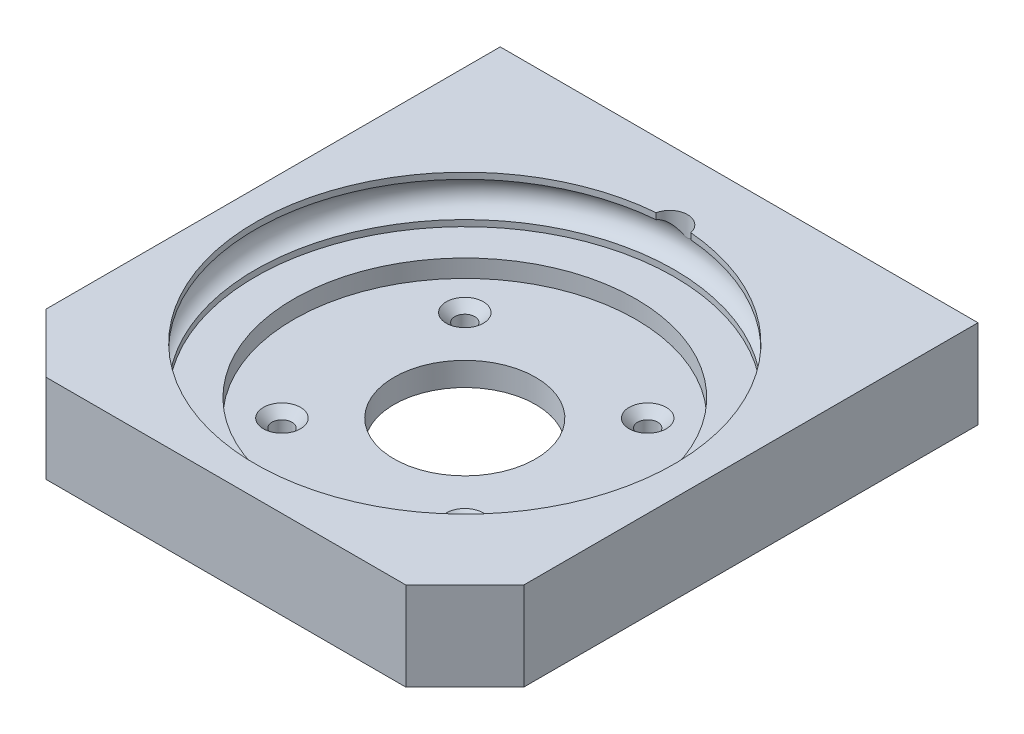
ISO-10303-21;
HEADER;
FILE_DESCRIPTION(('STEP AP214'),'2;1');
FILE_NAME('part.step','',(''),(''),'','','');
FILE_SCHEMA(('AUTOMOTIVE_DESIGN { 1 0 10303 214 1 1 1 1 }'));
ENDSEC;
DATA;
#1=APPLICATION_CONTEXT('core data for automotive mechanical design processes');
#2=APPLICATION_PROTOCOL_DEFINITION('international standard','automotive_design',2000,#1);
#3=PRODUCT_CONTEXT('',#1,'mechanical');
#4=PRODUCT('Part','Part','',(#3));
#5=PRODUCT_RELATED_PRODUCT_CATEGORY('part','',(#4));
#6=PRODUCT_DEFINITION_FORMATION('','',#4);
#7=PRODUCT_DEFINITION_CONTEXT('part definition',#1,'design');
#8=PRODUCT_DEFINITION('design','',#6,#7);
#9=PRODUCT_DEFINITION_SHAPE('','',#8);
#10=(LENGTH_UNIT() NAMED_UNIT(*) SI_UNIT(.MILLI.,.METRE.));
#11=(NAMED_UNIT(*) PLANE_ANGLE_UNIT() SI_UNIT($,.RADIAN.));
#12=(NAMED_UNIT(*) SI_UNIT($,.STERADIAN.) SOLID_ANGLE_UNIT());
#13=UNCERTAINTY_MEASURE_WITH_UNIT(LENGTH_MEASURE(1.E-05),#10,'distance_accuracy_value','');
#14=(GEOMETRIC_REPRESENTATION_CONTEXT(3) GLOBAL_UNCERTAINTY_ASSIGNED_CONTEXT((#13)) GLOBAL_UNIT_ASSIGNED_CONTEXT((#10,
#11,#12)) REPRESENTATION_CONTEXT('',''));
#15=CARTESIAN_POINT('',(0.,0.,0.));
#16=DIRECTION('',(0.,0.,1.));
#17=DIRECTION('',(1.,0.,0.));
#18=AXIS2_PLACEMENT_3D('',#15,#16,#17);
#19=CARTESIAN_POINT('',(0.,0.,0.));
#20=DIRECTION('',(0.,-1.,0.));
#21=DIRECTION('',(0.,0.,-1.));
#22=AXIS2_PLACEMENT_3D('',#19,#20,#21);
#23=CYLINDRICAL_SURFACE('',#22,35.5);
#24=DIRECTION('',(0.,-1.,0.));
#25=VECTOR('',#24,1.);
#26=CARTESIAN_POINT('',(2.93340513019144,12.,-35.3785971223021));
#27=LINE('',#26,#25);
#28=CARTESIAN_POINT('',(2.93340513019144,9.95634909981889,-35.3785971223022));
#29=VERTEX_POINT('',#28);
#30=CARTESIAN_POINT('',(2.93340513019144,11.,-35.3785971223022));
#31=VERTEX_POINT('',#30);
#32=EDGE_CURVE('E241',#29,#31,#27,.F.);
#33=ORIENTED_EDGE('',*,*,#32,.F.);
#34=CARTESIAN_POINT('',(0.,9.95634909981889,0.));
#35=DIRECTION('',(0.,-1.,0.));
#36=DIRECTION('',(0.,0.,-1.));
#37=AXIS2_PLACEMENT_3D('',#34,#35,#36);
#38=CIRCLE('',#37,35.5);
#39=CARTESIAN_POINT('',(-2.93340513019144,9.95634909981889,-35.3785971223022));
#40=VERTEX_POINT('',#39);
#41=EDGE_CURVE('E250',#40,#29,#38,.F.);
#42=ORIENTED_EDGE('',*,*,#41,.F.);
#43=DIRECTION('',(0.,-1.,0.));
#44=VECTOR('',#43,1.);
#45=CARTESIAN_POINT('',(-2.93340513019144,12.,-35.3785971223021));
#46=LINE('',#45,#44);
#47=CARTESIAN_POINT('',(-2.93340513019145,11.,-35.3785971223022));
#48=VERTEX_POINT('',#47);
#49=EDGE_CURVE('E233',#48,#40,#46,.T.);
#50=ORIENTED_EDGE('',*,*,#49,.F.);
#51=CARTESIAN_POINT('',(0.,11.,0.));
#52=DIRECTION('',(0.,-1.,0.));
#53=DIRECTION('',(0.,0.,-1.));
#54=AXIS2_PLACEMENT_3D('',#51,#52,#53);
#55=CIRCLE('',#54,35.5);
#56=EDGE_CURVE('E249',#31,#48,#55,.T.);
#57=ORIENTED_EDGE('',*,*,#56,.F.);
#58=EDGE_LOOP('',(#33,#42,#50,#57));
#59=FACE_BOUND('',#58,.T.);
#60=ADVANCED_FACE('F73',(#59),#23,.F.);
#61=CARTESIAN_POINT('',(0.,7.,0.));
#62=DIRECTION('',(0.,1.,0.));
#63=DIRECTION('',(0.,0.,1.));
#64=AXIS2_PLACEMENT_3D('',#61,#62,#63);
#65=TOROIDAL_SURFACE('',#64,34.75,3.05);
#66=CARTESIAN_POINT('',(0.,4.04365090018111,0.));
#67=DIRECTION('',(0.,1.,0.));
#68=DIRECTION('',(0.,0.,1.));
#69=AXIS2_PLACEMENT_3D('',#66,#67,#68);
#70=CIRCLE('',#69,35.5);
#71=CARTESIAN_POINT('',(0.,4.04365090018111,35.5));
#72=VERTEX_POINT('',#71);
#73=EDGE_CURVE('E245',#72,#72,#70,.F.);
#74=ORIENTED_EDGE('',*,*,#73,.T.);
#75=EDGE_LOOP('',(#74));
#76=FACE_BOUND('',#75,.T.);
#77=ORIENTED_EDGE('',*,*,#41,.T.);
#78=CARTESIAN_POINT('',(2.93357769228857,9.9565490998189,-35.3777913055362));
#79=CARTESIAN_POINT('',(2.91681852167683,9.93712004652138,-35.4561381258334));
#80=CARTESIAN_POINT('',(2.89706638531666,9.91491923800307,-35.5330652934432));
#81=CARTESIAN_POINT('',(2.85213354783402,9.86558276313324,-35.68353022709));
#82=CARTESIAN_POINT('',(2.82696252281035,9.83845590619164,-35.7570737545699));
#83=CARTESIAN_POINT('',(2.74467711357435,9.75114422744604,-35.970583603288));
#84=CARTESIAN_POINT('',(2.68038469278166,9.6845599494195,-36.1052269553901));
#85=CARTESIAN_POINT('',(2.52101398844778,9.52263714679613,-36.385840933118));
#86=CARTESIAN_POINT('',(2.4222794843095,9.42419458244767,-36.527876323929));
#87=CARTESIAN_POINT('',(2.20774315577035,9.21380910726637,-36.7882593406908));
#88=CARTESIAN_POINT('',(2.0918499714312,9.10179455227378,-36.9064716344005));
#89=CARTESIAN_POINT('',(1.88927351465423,8.9090304508235,-37.082815781667));
#90=CARTESIAN_POINT('',(1.80608443682101,8.83062532013071,-37.1476980302981));
#91=CARTESIAN_POINT('',(1.63499972765948,8.67123766592784,-37.2674764107356));
#92=CARTESIAN_POINT('',(1.54710173533544,8.59025385791051,-37.3223674712605));
#93=CARTESIAN_POINT('',(1.36731581757132,8.42716897831543,-37.4222650587613));
#94=CARTESIAN_POINT('',(1.27543766385374,8.34507094893154,-37.4672943143007));
#95=CARTESIAN_POINT('',(1.08748304388202,8.181115849756,-37.5478308600264));
#96=CARTESIAN_POINT('',(0.991409716626375,8.09925864711047,-37.5833451323951));
#97=CARTESIAN_POINT('',(0.830540031272119,7.96867350822542,-37.6334722120682));
#98=CARTESIAN_POINT('',(0.767419882316833,7.91896042695869,-37.6509435246551));
#99=CARTESIAN_POINT('',(0.638023053927769,7.82235093915175,-37.6821285792818));
#100=CARTESIAN_POINT('',(0.571745155656029,7.77545563627917,-37.6958408563773));
#101=CARTESIAN_POINT('',(0.456863092403969,7.70264186637944,-37.7153769925678));
#102=CARTESIAN_POINT('',(0.409621859505793,7.67489938826571,-37.7223117527688));
#103=CARTESIAN_POINT('',(0.311998249444104,7.62495381344345,-37.7341355484197));
#104=CARTESIAN_POINT('',(0.261624115589112,7.60273688953676,-37.7390297114924));
#105=CARTESIAN_POINT('',(0.175287569663979,7.57432709430206,-37.7450693295637));
#106=CARTESIAN_POINT('',(0.140364204275247,7.56524978523006,-37.746925837516));
#107=CARTESIAN_POINT('',(0.0695067562920698,7.5530289429442,-37.7494025584906));
#108=CARTESIAN_POINT('',(0.0335765551946004,7.54986514551429,-37.7500269939468));
#109=CARTESIAN_POINT('',(-0.0383704766689572,7.55014446114433,-37.7499710923409));
#110=CARTESIAN_POINT('',(-0.0743872166960304,7.55360875004191,-37.7492865733504));
#111=CARTESIAN_POINT('',(-0.145357912222274,7.56641478230117,-37.7466880857307));
#112=CARTESIAN_POINT('',(-0.180308283556722,7.57577445449057,-37.7447703663631));
#113=CARTESIAN_POINT('',(-0.287725949142726,7.61182500636119,-37.7370778836044));
#114=CARTESIAN_POINT('',(-0.357374622448034,7.64609371954267,-37.7294004148712));
#115=CARTESIAN_POINT('',(-0.491598193215968,7.72284253640532,-37.7102330528399));
#116=CARTESIAN_POINT('',(-0.556121745535096,7.76539381438275,-37.6987094465921));
#117=CARTESIAN_POINT('',(-0.669397199331338,7.84540894656481,-37.6748139910309));
#118=CARTESIAN_POINT('',(-0.718743493297258,7.88221335856247,-37.6630612081378));
#119=CARTESIAN_POINT('',(-0.815833685027164,7.95716155305739,-37.6373760943515));
#120=CARTESIAN_POINT('',(-0.863576879154051,7.99530590903692,-37.6234428211953));
#121=CARTESIAN_POINT('',(-1.00506389342119,8.11085973863013,-37.5783686844568));
#122=CARTESIAN_POINT('',(-1.09694859009175,8.18930275768496,-37.5439786291303));
#123=CARTESIAN_POINT('',(-1.27662460550438,8.34617752836101,-37.4665703836723));
#124=CARTESIAN_POINT('',(-1.36442374417502,8.42460898868724,-37.4235695890444));
#125=CARTESIAN_POINT('',(-1.53613708079947,8.58024908926615,-37.3287391324199));
#126=CARTESIAN_POINT('',(-1.62005428446559,8.65745864407599,-37.2769164516535));
#127=CARTESIAN_POINT('',(-1.77241118462468,8.79915829898961,-37.1719590600469));
#128=CARTESIAN_POINT('',(-1.84138845949647,8.86393308329642,-37.1199927235774));
#129=CARTESIAN_POINT('',(-1.97580372560904,8.99119312336032,-37.0091588000968));
#130=CARTESIAN_POINT('',(-2.04124101180683,9.05367792223828,-36.9502898456647));
#131=CARTESIAN_POINT('',(-2.23132584810941,9.23659847801168,-36.7631423510781));
#132=CARTESIAN_POINT('',(-2.3500264139525,9.35276225866135,-36.6241345568339));
#133=CARTESIAN_POINT('',(-2.53618892329528,9.53807892434234,-36.3583021156226));
#134=CARTESIAN_POINT('',(-2.6088787357026,9.61151391423537,-36.2380870239174));
#135=CARTESIAN_POINT('',(-2.7386686830064,9.74490856749262,-35.9828939471452));
#136=CARTESIAN_POINT('',(-2.79582066357193,9.80491292389318,-35.8479672165023));
#137=CARTESIAN_POINT('',(-2.86122008050853,9.87553189675219,-35.653648126164));
#138=CARTESIAN_POINT('',(-2.87774148933525,9.89361413084943,-35.5996133628247));
#139=CARTESIAN_POINT('',(-2.90788471084407,9.92712634236118,-35.4898926827029));
#140=CARTESIAN_POINT('',(-2.92150439462234,9.94255437088241,-35.4342055875481));
#141=CARTESIAN_POINT('',(-2.93357769228857,9.95654909981889,-35.3777913055362));
#142=B_SPLINE_CURVE_WITH_KNOTS('',3,(#78,#79,#80,#81,#82,#83,#84,#85,#86,#87,#88,#89,#90,#91,
#92,#93,#94,#95,#96,#97,#98,#99,#100,#101,#102,#103,#104,#105,#106,#107,#108,#109,#110,#111,
#112,#113,#114,#115,#116,#117,#118,#119,#120,#121,#122,#123,#124,#125,#126,#127,#128,#129,#130,
#131,#132,#133,#134,#135,#136,#137,#138,#139,#140,#141),.UNSPECIFIED.,.F.,.F.,(4,2,2,2,2,2,2,2,
2,2,2,2,2,2,2,2,2,2,2,2,2,2,2,2,2,2,2,2,2,2,2,4),(0.,0.247068873927623,0.493700181725903,
0.981349651084765,1.57536627773394,2.17266770653428,2.56654613560895,2.96062393355249,
3.35378371036501,3.74665418777205,3.99321838902479,4.23987854334683,4.40535324197185,
4.57040959180619,4.67839753688297,4.7860147493383,4.89397635841886,5.00226789228376,
5.23443772502072,5.46869853984813,5.65660416856953,5.84459122298041,6.22100710195904,
6.59667007729738,6.97203714076914,7.29559386058487,7.61921478620871,8.26518750001138,
8.73917848205436,9.21156790837591,9.38942147520736,9.56740508162527),.UNSPECIFIED.);
#143=EDGE_CURVE('E265',#29,#40,#142,.T.);
#144=ORIENTED_EDGE('',*,*,#143,.T.);
#145=EDGE_LOOP('',(#77,#144));
#146=FACE_BOUND('',#145,.T.);
#147=ADVANCED_FACE('F280',(#76,#146),#65,.F.);
#148=CARTESIAN_POINT('',(0.,3.,0.));
#149=DIRECTION('',(0.,-1.,0.));
#150=DIRECTION('',(0.,0.,-1.));
#151=AXIS2_PLACEMENT_3D('',#148,#149,#150);
#152=CIRCLE('',#151,35.5);
#153=CARTESIAN_POINT('',(0.,3.,-35.5));
#154=VERTEX_POINT('',#153);
#155=EDGE_CURVE('E246',#154,#154,#152,.T.);
#156=ORIENTED_EDGE('',*,*,#155,.T.);
#157=EDGE_LOOP('',(#156));
#158=FACE_BOUND('',#157,.T.);
#159=ORIENTED_EDGE('',*,*,#73,.F.);
#160=EDGE_LOOP('',(#159));
#161=FACE_BOUND('',#160,.T.);
#162=ADVANCED_FACE('F366',(#158,#161),#23,.F.);
#163=CARTESIAN_POINT('',(-29.,3.,0.));
#164=DIRECTION('',(0.,-1.,0.));
#165=DIRECTION('',(0.,0.,-1.));
#166=AXIS2_PLACEMENT_3D('',#163,#164,#165);
#167=PLANE('',#166);
#168=ORIENTED_EDGE('',*,*,#155,.F.);
#169=EDGE_LOOP('',(#168));
#170=FACE_BOUND('',#169,.T.);
#171=CARTESIAN_POINT('',(0.,3.,0.));
#172=DIRECTION('',(0.,-1.,0.));
#173=DIRECTION('',(0.,0.,-1.));
#174=AXIS2_PLACEMENT_3D('',#171,#172,#173);
#175=CIRCLE('',#174,29.);
#176=CARTESIAN_POINT('',(0.,3.,-29.));
#177=VERTEX_POINT('',#176);
#178=EDGE_CURVE('E262',#177,#177,#175,.T.);
#179=ORIENTED_EDGE('',*,*,#178,.T.);
#180=EDGE_LOOP('',(#179));
#181=FACE_BOUND('',#180,.T.);
#182=ADVANCED_FACE('F374',(#170,#181),#167,.F.);
#183=CARTESIAN_POINT('',(0.,0.,0.));
#184=DIRECTION('',(0.,-1.,0.));
#185=DIRECTION('',(0.,0.,-1.));
#186=AXIS2_PLACEMENT_3D('',#183,#184,#185);
#187=CYLINDRICAL_SURFACE('',#186,29.);
#188=ORIENTED_EDGE('',*,*,#178,.F.);
#189=EDGE_LOOP('',(#188));
#190=FACE_BOUND('',#189,.T.);
#191=CARTESIAN_POINT('',(0.,0.,0.));
#192=DIRECTION('',(0.,-1.,0.));
#193=DIRECTION('',(0.,0.,-1.));
#194=AXIS2_PLACEMENT_3D('',#191,#192,#193);
#195=CIRCLE('',#194,29.);
#196=CARTESIAN_POINT('',(0.,0.,-29.));
#197=VERTEX_POINT('',#196);
#198=EDGE_CURVE('E259',#197,#197,#195,.T.);
#199=ORIENTED_EDGE('',*,*,#198,.T.);
#200=EDGE_LOOP('',(#199));
#201=FACE_BOUND('',#200,.T.);
#202=ADVANCED_FACE('F379',(#190,#201),#187,.F.);
#203=CARTESIAN_POINT('',(-29.,0.,0.));
#204=DIRECTION('',(0.,-1.,0.));
#205=DIRECTION('',(0.,0.,-1.));
#206=AXIS2_PLACEMENT_3D('',#203,#204,#205);
#207=PLANE('',#206);
#208=CARTESIAN_POINT('',(-15.5,0.,-15.5));
#209=DIRECTION('',(0.,1.,0.));
#210=DIRECTION('',(0.,0.,1.));
#211=AXIS2_PLACEMENT_3D('',#208,#209,#210);
#212=CIRCLE('',#211,3.15);
#213=CARTESIAN_POINT('',(-15.5,0.,-12.35));
#214=VERTEX_POINT('',#213);
#215=EDGE_CURVE('E188',#214,#214,#212,.T.);
#216=ORIENTED_EDGE('',*,*,#215,.F.);
#217=EDGE_LOOP('',(#216));
#218=FACE_BOUND('',#217,.T.);
#219=CARTESIAN_POINT('',(15.5,0.,-15.5));
#220=DIRECTION('',(0.,1.,0.));
#221=DIRECTION('',(0.,0.,1.));
#222=AXIS2_PLACEMENT_3D('',#219,#220,#221);
#223=CIRCLE('',#222,3.15);
#224=CARTESIAN_POINT('',(15.5,0.,-12.35));
#225=VERTEX_POINT('',#224);
#226=EDGE_CURVE('E197',#225,#225,#223,.T.);
#227=ORIENTED_EDGE('',*,*,#226,.F.);
#228=EDGE_LOOP('',(#227));
#229=FACE_BOUND('',#228,.T.);
#230=CARTESIAN_POINT('',(15.5,0.,15.5));
#231=DIRECTION('',(0.,1.,0.));
#232=DIRECTION('',(0.,0.,1.));
#233=AXIS2_PLACEMENT_3D('',#230,#231,#232);
#234=CIRCLE('',#233,3.15);
#235=CARTESIAN_POINT('',(15.5,0.,18.65));
#236=VERTEX_POINT('',#235);
#237=EDGE_CURVE('E206',#236,#236,#234,.T.);
#238=ORIENTED_EDGE('',*,*,#237,.F.);
#239=EDGE_LOOP('',(#238));
#240=FACE_BOUND('',#239,.T.);
#241=CARTESIAN_POINT('',(-15.5,0.,15.5));
#242=DIRECTION('',(0.,1.,0.));
#243=DIRECTION('',(0.,0.,1.));
#244=AXIS2_PLACEMENT_3D('',#241,#242,#243);
#245=CIRCLE('',#244,3.15);
#246=CARTESIAN_POINT('',(-15.5,0.,18.65));
#247=VERTEX_POINT('',#246);
#248=EDGE_CURVE('E215',#247,#247,#245,.T.);
#249=ORIENTED_EDGE('',*,*,#248,.F.);
#250=EDGE_LOOP('',(#249));
#251=FACE_BOUND('',#250,.T.);
#252=ORIENTED_EDGE('',*,*,#198,.F.);
#253=EDGE_LOOP('',(#252));
#254=FACE_BOUND('',#253,.T.);
#255=CARTESIAN_POINT('',(0.,0.,0.));
#256=DIRECTION('',(0.,-1.,0.));
#257=DIRECTION('',(0.,0.,-1.));
#258=AXIS2_PLACEMENT_3D('',#255,#256,#257);
#259=CIRCLE('',#258,12.);
#260=CARTESIAN_POINT('',(0.,0.,-12.));
#261=VERTEX_POINT('',#260);
#262=EDGE_CURVE('E256',#261,#261,#259,.T.);
#263=ORIENTED_EDGE('',*,*,#262,.T.);
#264=EDGE_LOOP('',(#263));
#265=FACE_BOUND('',#264,.T.);
#266=ADVANCED_FACE('F435',(#218,#229,#240,#251,#254,#265),#207,.F.);
#267=CARTESIAN_POINT('',(0.,0.,0.));
#268=DIRECTION('',(0.,-1.,0.));
#269=DIRECTION('',(0.,0.,-1.));
#270=AXIS2_PLACEMENT_3D('',#267,#268,#269);
#271=CYLINDRICAL_SURFACE('',#270,12.);
#272=ORIENTED_EDGE('',*,*,#262,.F.);
#273=EDGE_LOOP('',(#272));
#274=FACE_BOUND('',#273,.T.);
#275=CARTESIAN_POINT('',(0.,-4.,0.));
#276=DIRECTION('',(0.,-1.,0.));
#277=DIRECTION('',(0.,0.,-1.));
#278=AXIS2_PLACEMENT_3D('',#275,#276,#277);
#279=CIRCLE('',#278,12.);
#280=CARTESIAN_POINT('',(0.,-4.,-12.));
#281=VERTEX_POINT('',#280);
#282=EDGE_CURVE('E253',#281,#281,#279,.T.);
#283=ORIENTED_EDGE('',*,*,#282,.T.);
#284=EDGE_LOOP('',(#283));
#285=FACE_BOUND('',#284,.T.);
#286=ADVANCED_FACE('F439',(#274,#285),#271,.F.);
#287=CARTESIAN_POINT('',(-12.,-4.,0.));
#288=DIRECTION('',(0.,1.,0.));
#289=DIRECTION('',(0.,0.,1.));
#290=AXIS2_PLACEMENT_3D('',#287,#288,#289);
#291=PLANE('',#290);
#292=CARTESIAN_POINT('',(-15.5,-4.,-15.5));
#293=DIRECTION('',(0.,1.,0.));
#294=DIRECTION('',(0.,0.,1.));
#295=AXIS2_PLACEMENT_3D('',#292,#293,#294);
#296=CIRCLE('',#295,1.7);
#297=CARTESIAN_POINT('',(-15.5,-4.,-13.8));
#298=VERTEX_POINT('',#297);
#299=EDGE_CURVE('E194',#298,#298,#296,.T.);
#300=ORIENTED_EDGE('',*,*,#299,.T.);
#301=EDGE_LOOP('',(#300));
#302=FACE_BOUND('',#301,.T.);
#303=CARTESIAN_POINT('',(15.5,-4.,-15.5));
#304=DIRECTION('',(0.,1.,0.));
#305=DIRECTION('',(0.,0.,1.));
#306=AXIS2_PLACEMENT_3D('',#303,#304,#305);
#307=CIRCLE('',#306,1.7);
#308=CARTESIAN_POINT('',(15.5,-4.,-13.8));
#309=VERTEX_POINT('',#308);
#310=EDGE_CURVE('E203',#309,#309,#307,.T.);
#311=ORIENTED_EDGE('',*,*,#310,.T.);
#312=EDGE_LOOP('',(#311));
#313=FACE_BOUND('',#312,.T.);
#314=CARTESIAN_POINT('',(15.5,-4.,15.5));
#315=DIRECTION('',(0.,1.,0.));
#316=DIRECTION('',(0.,0.,1.));
#317=AXIS2_PLACEMENT_3D('',#314,#315,#316);
#318=CIRCLE('',#317,1.7);
#319=CARTESIAN_POINT('',(15.5,-4.,17.2));
#320=VERTEX_POINT('',#319);
#321=EDGE_CURVE('E212',#320,#320,#318,.T.);
#322=ORIENTED_EDGE('',*,*,#321,.T.);
#323=EDGE_LOOP('',(#322));
#324=FACE_BOUND('',#323,.T.);
#325=CARTESIAN_POINT('',(-15.5,-4.,15.5));
#326=DIRECTION('',(0.,1.,0.));
#327=DIRECTION('',(0.,0.,1.));
#328=AXIS2_PLACEMENT_3D('',#325,#326,#327);
#329=CIRCLE('',#328,1.7);
#330=CARTESIAN_POINT('',(-15.5,-4.,17.2));
#331=VERTEX_POINT('',#330);
#332=EDGE_CURVE('E221',#331,#331,#329,.T.);
#333=ORIENTED_EDGE('',*,*,#332,.T.);
#334=EDGE_LOOP('',(#333));
#335=FACE_BOUND('',#334,.T.);
#336=ORIENTED_EDGE('',*,*,#282,.F.);
#337=EDGE_LOOP('',(#336));
#338=FACE_BOUND('',#337,.T.);
#339=DIRECTION('',(1.,0.,0.));
#340=VECTOR('',#339,1.);
#341=CARTESIAN_POINT('',(0.,-4.,40.5));
#342=LINE('',#341,#340);
#343=CARTESIAN_POINT('',(-30.5,-4.,40.5));
#344=VERTEX_POINT('',#343);
#345=CARTESIAN_POINT('',(30.5,-4.,40.5));
#346=VERTEX_POINT('',#345);
#347=EDGE_CURVE('E229',#344,#346,#342,.T.);
#348=ORIENTED_EDGE('',*,*,#347,.F.);
#349=DIRECTION('',(0.707106781186546,0.,0.707106781186549));
#350=VECTOR('',#349,1.);
#351=CARTESIAN_POINT('',(-30.5,-4.,40.5));
#352=LINE('',#351,#350);
#353=CARTESIAN_POINT('',(-40.5,-4.,30.5));
#354=VERTEX_POINT('',#353);
#355=EDGE_CURVE('E416',#344,#354,#352,.F.);
#356=ORIENTED_EDGE('',*,*,#355,.T.);
#357=DIRECTION('',(0.,0.,1.));
#358=VECTOR('',#357,1.);
#359=CARTESIAN_POINT('',(-40.5,-4.,0.));
#360=LINE('',#359,#358);
#361=CARTESIAN_POINT('',(-40.5,-4.,-46.5));
#362=VERTEX_POINT('',#361);
#363=EDGE_CURVE('E237',#362,#354,#360,.T.);
#364=ORIENTED_EDGE('',*,*,#363,.F.);
#365=DIRECTION('',(-1.,0.,0.));
#366=VECTOR('',#365,1.);
#367=CARTESIAN_POINT('',(40.5,-4.,-46.5));
#368=LINE('',#367,#366);
#369=CARTESIAN_POINT('',(40.5,-4.,-46.5));
#370=VERTEX_POINT('',#369);
#371=EDGE_CURVE('E185',#370,#362,#368,.T.);
#372=ORIENTED_EDGE('',*,*,#371,.F.);
#373=DIRECTION('',(0.,0.,1.));
#374=VECTOR('',#373,1.);
#375=CARTESIAN_POINT('',(40.5,-4.,0.));
#376=LINE('',#375,#374);
#377=CARTESIAN_POINT('',(40.5,-4.,30.5));
#378=VERTEX_POINT('',#377);
#379=EDGE_CURVE('E224',#370,#378,#376,.T.);
#380=ORIENTED_EDGE('',*,*,#379,.T.);
#381=DIRECTION('',(-0.707106781186549,0.,0.707106781186546));
#382=VECTOR('',#381,1.);
#383=CARTESIAN_POINT('',(40.5,-4.,30.5));
#384=LINE('',#383,#382);
#385=EDGE_CURVE('E417',#378,#346,#384,.T.);
#386=ORIENTED_EDGE('',*,*,#385,.T.);
#387=EDGE_LOOP('',(#348,#356,#364,#372,#380,#386));
#388=FACE_BOUND('',#387,.T.);
#389=ADVANCED_FACE('F392',(#302,#313,#324,#335,#338,#388),#291,.F.);
#390=CARTESIAN_POINT('',(-35.5,11.,0.));
#391=DIRECTION('',(0.,-1.,0.));
#392=DIRECTION('',(0.,0.,-1.));
#393=AXIS2_PLACEMENT_3D('',#390,#391,#392);
#394=PLANE('',#393);
#395=CARTESIAN_POINT('',(0.,11.,-34.75));
#396=DIRECTION('',(0.,-1.,0.));
#397=DIRECTION('',(0.,0.,-1.));
#398=AXIS2_PLACEMENT_3D('',#395,#396,#397);
#399=CIRCLE('',#398,3.);
#400=EDGE_CURVE('E243',#31,#48,#399,.F.);
#401=ORIENTED_EDGE('',*,*,#400,.F.);
#402=ORIENTED_EDGE('',*,*,#56,.T.);
#403=EDGE_LOOP('',(#401,#402));
#404=FACE_BOUND('',#403,.T.);
#405=DIRECTION('',(0.,0.,-1.));
#406=VECTOR('',#405,1.);
#407=CARTESIAN_POINT('',(-40.5,11.,0.));
#408=LINE('',#407,#406);
#409=CARTESIAN_POINT('',(-40.5,11.,30.5));
#410=VERTEX_POINT('',#409);
#411=CARTESIAN_POINT('',(-40.5,11.,-46.5));
#412=VERTEX_POINT('',#411);
#413=EDGE_CURVE('E234',#410,#412,#408,.T.);
#414=ORIENTED_EDGE('',*,*,#413,.F.);
#415=DIRECTION('',(-0.707106781186546,0.,-0.707106781186549));
#416=VECTOR('',#415,1.);
#417=CARTESIAN_POINT('',(-30.5,11.,40.5));
#418=LINE('',#417,#416);
#419=CARTESIAN_POINT('',(-30.5,11.,40.5));
#420=VERTEX_POINT('',#419);
#421=EDGE_CURVE('E83',#410,#420,#418,.F.);
#422=ORIENTED_EDGE('',*,*,#421,.T.);
#423=DIRECTION('',(-1.,0.,0.));
#424=VECTOR('',#423,1.);
#425=CARTESIAN_POINT('',(0.,11.,40.5));
#426=LINE('',#425,#424);
#427=CARTESIAN_POINT('',(30.5,11.,40.5));
#428=VERTEX_POINT('',#427);
#429=EDGE_CURVE('E230',#428,#420,#426,.T.);
#430=ORIENTED_EDGE('',*,*,#429,.F.);
#431=DIRECTION('',(0.707106781186549,0.,-0.707106781186546));
#432=VECTOR('',#431,1.);
#433=CARTESIAN_POINT('',(40.5,11.,30.5));
#434=LINE('',#433,#432);
#435=CARTESIAN_POINT('',(40.5,11.,30.5));
#436=VERTEX_POINT('',#435);
#437=EDGE_CURVE('E91',#428,#436,#434,.T.);
#438=ORIENTED_EDGE('',*,*,#437,.T.);
#439=DIRECTION('',(0.,0.,-1.));
#440=VECTOR('',#439,1.);
#441=CARTESIAN_POINT('',(40.5,11.,0.));
#442=LINE('',#441,#440);
#443=CARTESIAN_POINT('',(40.5,11.,-46.5));
#444=VERTEX_POINT('',#443);
#445=EDGE_CURVE('E227',#436,#444,#442,.T.);
#446=ORIENTED_EDGE('',*,*,#445,.T.);
#447=DIRECTION('',(1.,0.,0.));
#448=VECTOR('',#447,1.);
#449=CARTESIAN_POINT('',(-40.5,11.,-46.5));
#450=LINE('',#449,#448);
#451=EDGE_CURVE('E179',#412,#444,#450,.T.);
#452=ORIENTED_EDGE('',*,*,#451,.F.);
#453=EDGE_LOOP('',(#414,#422,#430,#438,#446,#452));
#454=FACE_BOUND('',#453,.T.);
#455=ADVANCED_FACE('F288',(#404,#454),#394,.F.);
#456=CARTESIAN_POINT('',(0.,17.,-34.75));
#457=DIRECTION('',(0.,-1.,0.));
#458=DIRECTION('',(0.,0.,-1.));
#459=AXIS2_PLACEMENT_3D('',#456,#457,#458);
#460=CYLINDRICAL_SURFACE('',#459,3.);
#461=ORIENTED_EDGE('',*,*,#400,.T.);
#462=ORIENTED_EDGE('',*,*,#49,.T.);
#463=ORIENTED_EDGE('',*,*,#143,.F.);
#464=ORIENTED_EDGE('',*,*,#32,.T.);
#465=EDGE_LOOP('',(#461,#462,#463,#464));
#466=FACE_BOUND('',#465,.T.);
#467=ADVANCED_FACE('F283',(#466),#460,.F.);
#468=CARTESIAN_POINT('',(-40.5,68.2756492761103,0.));
#469=DIRECTION('',(1.,0.,0.));
#470=DIRECTION('',(0.,0.,-1.));
#471=AXIS2_PLACEMENT_3D('',#468,#469,#470);
#472=PLANE('',#471);
#473=ORIENTED_EDGE('',*,*,#363,.T.);
#474=DIRECTION('',(0.,1.,0.));
#475=VECTOR('',#474,1.);
#476=CARTESIAN_POINT('',(-40.5,68.2756492761103,30.5));
#477=LINE('',#476,#475);
#478=EDGE_CURVE('E99',#354,#410,#477,.T.);
#479=ORIENTED_EDGE('',*,*,#478,.T.);
#480=ORIENTED_EDGE('',*,*,#413,.T.);
#481=DIRECTION('',(0.,1.,0.));
#482=VECTOR('',#481,1.);
#483=CARTESIAN_POINT('',(-40.5,-4.,-46.5));
#484=LINE('',#483,#482);
#485=EDGE_CURVE('E167',#362,#412,#484,.T.);
#486=ORIENTED_EDGE('',*,*,#485,.F.);
#487=EDGE_LOOP('',(#473,#479,#480,#486));
#488=FACE_BOUND('',#487,.T.);
#489=ADVANCED_FACE('F287',(#488),#472,.F.);
#490=CARTESIAN_POINT('',(0.,68.2756492761103,40.5));
#491=DIRECTION('',(0.,0.,-1.));
#492=DIRECTION('',(-1.,0.,0.));
#493=AXIS2_PLACEMENT_3D('',#490,#491,#492);
#494=PLANE('',#493);
#495=ORIENTED_EDGE('',*,*,#429,.T.);
#496=DIRECTION('',(0.,-1.,0.));
#497=VECTOR('',#496,1.);
#498=CARTESIAN_POINT('',(-30.5,68.2756492761103,40.5));
#499=LINE('',#498,#497);
#500=EDGE_CURVE('E399',#420,#344,#499,.T.);
#501=ORIENTED_EDGE('',*,*,#500,.T.);
#502=ORIENTED_EDGE('',*,*,#347,.T.);
#503=DIRECTION('',(0.,1.,0.));
#504=VECTOR('',#503,1.);
#505=CARTESIAN_POINT('',(30.5,11.,40.5));
#506=LINE('',#505,#504);
#507=EDGE_CURVE('E278',#346,#428,#506,.T.);
#508=ORIENTED_EDGE('',*,*,#507,.T.);
#509=EDGE_LOOP('',(#495,#501,#502,#508));
#510=FACE_BOUND('',#509,.T.);
#511=ADVANCED_FACE('F290',(#510),#494,.F.);
#512=CARTESIAN_POINT('',(40.5,68.2756492761103,0.));
#513=DIRECTION('',(1.,0.,0.));
#514=DIRECTION('',(0.,0.,-1.));
#515=AXIS2_PLACEMENT_3D('',#512,#513,#514);
#516=PLANE('',#515);
#517=ORIENTED_EDGE('',*,*,#445,.F.);
#518=DIRECTION('',(0.,-1.,0.));
#519=VECTOR('',#518,1.);
#520=CARTESIAN_POINT('',(40.5,-4.,30.5));
#521=LINE('',#520,#519);
#522=EDGE_CURVE('E12',#436,#378,#521,.T.);
#523=ORIENTED_EDGE('',*,*,#522,.T.);
#524=ORIENTED_EDGE('',*,*,#379,.F.);
#525=DIRECTION('',(0.,-1.,0.));
#526=VECTOR('',#525,1.);
#527=CARTESIAN_POINT('',(40.5,11.,-46.5));
#528=LINE('',#527,#526);
#529=EDGE_CURVE('E182',#444,#370,#528,.T.);
#530=ORIENTED_EDGE('',*,*,#529,.F.);
#531=EDGE_LOOP('',(#517,#523,#524,#530));
#532=FACE_BOUND('',#531,.T.);
#533=ADVANCED_FACE('F293',(#532),#516,.T.);
#534=CARTESIAN_POINT('',(-30.5,68.2756492761103,40.5));
#535=DIRECTION('',(0.707106781186549,0.,-0.707106781186546));
#536=DIRECTION('',(0.,-1.,0.));
#537=AXIS2_PLACEMENT_3D('',#534,#535,#536);
#538=PLANE('',#537);
#539=ORIENTED_EDGE('',*,*,#421,.F.);
#540=ORIENTED_EDGE('',*,*,#478,.F.);
#541=ORIENTED_EDGE('',*,*,#355,.F.);
#542=ORIENTED_EDGE('',*,*,#500,.F.);
#543=EDGE_LOOP('',(#539,#540,#541,#542));
#544=FACE_BOUND('',#543,.T.);
#545=ADVANCED_FACE('F299',(#544),#538,.F.);
#546=CARTESIAN_POINT('',(40.5,68.2756492761103,30.5));
#547=DIRECTION('',(0.707106781186546,0.,0.707106781186549));
#548=DIRECTION('',(0.,1.,0.));
#549=AXIS2_PLACEMENT_3D('',#546,#547,#548);
#550=PLANE('',#549);
#551=ORIENTED_EDGE('',*,*,#437,.F.);
#552=ORIENTED_EDGE('',*,*,#507,.F.);
#553=ORIENTED_EDGE('',*,*,#385,.F.);
#554=ORIENTED_EDGE('',*,*,#522,.F.);
#555=EDGE_LOOP('',(#551,#552,#553,#554));
#556=FACE_BOUND('',#555,.T.);
#557=ADVANCED_FACE('F76',(#556),#550,.T.);
#558=CARTESIAN_POINT('',(-15.5,0.,15.5));
#559=DIRECTION('',(0.,1.,0.));
#560=DIRECTION('',(0.,0.,1.));
#561=AXIS2_PLACEMENT_3D('',#558,#559,#560);
#562=CYLINDRICAL_SURFACE('',#561,1.7);
#563=ORIENTED_EDGE('',*,*,#332,.F.);
#564=EDGE_LOOP('',(#563));
#565=FACE_BOUND('',#564,.T.);
#566=CARTESIAN_POINT('',(-15.5,-1.45,15.5));
#567=DIRECTION('',(0.,1.,0.));
#568=DIRECTION('',(0.,0.,1.));
#569=AXIS2_PLACEMENT_3D('',#566,#567,#568);
#570=CIRCLE('',#569,1.7);
#571=CARTESIAN_POINT('',(-15.5,-1.45,17.2));
#572=VERTEX_POINT('',#571);
#573=EDGE_CURVE('E218',#572,#572,#570,.T.);
#574=ORIENTED_EDGE('',*,*,#573,.T.);
#575=EDGE_LOOP('',(#574));
#576=FACE_BOUND('',#575,.T.);
#577=ADVANCED_FACE('F301',(#565,#576),#562,.F.);
#578=CARTESIAN_POINT('',(-15.5,0.,15.5));
#579=DIRECTION('',(0.,1.,0.));
#580=DIRECTION('',(0.,0.,1.));
#581=AXIS2_PLACEMENT_3D('',#578,#579,#580);
#582=CONICAL_SURFACE('',#581,3.15,0.785398163397449);
#583=ORIENTED_EDGE('',*,*,#573,.F.);
#584=EDGE_LOOP('',(#583));
#585=FACE_BOUND('',#584,.T.);
#586=ORIENTED_EDGE('',*,*,#248,.T.);
#587=EDGE_LOOP('',(#586));
#588=FACE_BOUND('',#587,.T.);
#589=ADVANCED_FACE('F304',(#585,#588),#582,.F.);
#590=CARTESIAN_POINT('',(15.5,0.,15.5));
#591=DIRECTION('',(0.,1.,0.));
#592=DIRECTION('',(0.,0.,1.));
#593=AXIS2_PLACEMENT_3D('',#590,#591,#592);
#594=CYLINDRICAL_SURFACE('',#593,1.7);
#595=ORIENTED_EDGE('',*,*,#321,.F.);
#596=EDGE_LOOP('',(#595));
#597=FACE_BOUND('',#596,.T.);
#598=CARTESIAN_POINT('',(15.5,-1.45,15.5));
#599=DIRECTION('',(0.,1.,0.));
#600=DIRECTION('',(0.,0.,1.));
#601=AXIS2_PLACEMENT_3D('',#598,#599,#600);
#602=CIRCLE('',#601,1.7);
#603=CARTESIAN_POINT('',(15.5,-1.45,17.2));
#604=VERTEX_POINT('',#603);
#605=EDGE_CURVE('E209',#604,#604,#602,.T.);
#606=ORIENTED_EDGE('',*,*,#605,.T.);
#607=EDGE_LOOP('',(#606));
#608=FACE_BOUND('',#607,.T.);
#609=ADVANCED_FACE('F308',(#597,#608),#594,.F.);
#610=CARTESIAN_POINT('',(15.5,0.,15.5));
#611=DIRECTION('',(0.,1.,0.));
#612=DIRECTION('',(0.,0.,1.));
#613=AXIS2_PLACEMENT_3D('',#610,#611,#612);
#614=CONICAL_SURFACE('',#613,3.15,0.785398163397449);
#615=ORIENTED_EDGE('',*,*,#605,.F.);
#616=EDGE_LOOP('',(#615));
#617=FACE_BOUND('',#616,.T.);
#618=ORIENTED_EDGE('',*,*,#237,.T.);
#619=EDGE_LOOP('',(#618));
#620=FACE_BOUND('',#619,.T.);
#621=ADVANCED_FACE('F312',(#617,#620),#614,.F.);
#622=CARTESIAN_POINT('',(15.5,0.,-15.5));
#623=DIRECTION('',(0.,1.,0.));
#624=DIRECTION('',(0.,0.,1.));
#625=AXIS2_PLACEMENT_3D('',#622,#623,#624);
#626=CYLINDRICAL_SURFACE('',#625,1.7);
#627=ORIENTED_EDGE('',*,*,#310,.F.);
#628=EDGE_LOOP('',(#627));
#629=FACE_BOUND('',#628,.T.);
#630=CARTESIAN_POINT('',(15.5,-1.45,-15.5));
#631=DIRECTION('',(0.,1.,0.));
#632=DIRECTION('',(0.,0.,1.));
#633=AXIS2_PLACEMENT_3D('',#630,#631,#632);
#634=CIRCLE('',#633,1.7);
#635=CARTESIAN_POINT('',(15.5,-1.45,-13.8));
#636=VERTEX_POINT('',#635);
#637=EDGE_CURVE('E200',#636,#636,#634,.T.);
#638=ORIENTED_EDGE('',*,*,#637,.T.);
#639=EDGE_LOOP('',(#638));
#640=FACE_BOUND('',#639,.T.);
#641=ADVANCED_FACE('F316',(#629,#640),#626,.F.);
#642=CARTESIAN_POINT('',(15.5,0.,-15.5));
#643=DIRECTION('',(0.,1.,0.));
#644=DIRECTION('',(0.,0.,1.));
#645=AXIS2_PLACEMENT_3D('',#642,#643,#644);
#646=CONICAL_SURFACE('',#645,3.15,0.785398163397449);
#647=ORIENTED_EDGE('',*,*,#637,.F.);
#648=EDGE_LOOP('',(#647));
#649=FACE_BOUND('',#648,.T.);
#650=ORIENTED_EDGE('',*,*,#226,.T.);
#651=EDGE_LOOP('',(#650));
#652=FACE_BOUND('',#651,.T.);
#653=ADVANCED_FACE('F320',(#649,#652),#646,.F.);
#654=CARTESIAN_POINT('',(-15.5,0.,-15.5));
#655=DIRECTION('',(0.,1.,0.));
#656=DIRECTION('',(0.,0.,1.));
#657=AXIS2_PLACEMENT_3D('',#654,#655,#656);
#658=CYLINDRICAL_SURFACE('',#657,1.7);
#659=ORIENTED_EDGE('',*,*,#299,.F.);
#660=EDGE_LOOP('',(#659));
#661=FACE_BOUND('',#660,.T.);
#662=CARTESIAN_POINT('',(-15.5,-1.45,-15.5));
#663=DIRECTION('',(0.,1.,0.));
#664=DIRECTION('',(0.,0.,1.));
#665=AXIS2_PLACEMENT_3D('',#662,#663,#664);
#666=CIRCLE('',#665,1.7);
#667=CARTESIAN_POINT('',(-15.5,-1.45,-13.8));
#668=VERTEX_POINT('',#667);
#669=EDGE_CURVE('E191',#668,#668,#666,.T.);
#670=ORIENTED_EDGE('',*,*,#669,.T.);
#671=EDGE_LOOP('',(#670));
#672=FACE_BOUND('',#671,.T.);
#673=ADVANCED_FACE('F324',(#661,#672),#658,.F.);
#674=CARTESIAN_POINT('',(-15.5,0.,-15.5));
#675=DIRECTION('',(0.,1.,0.));
#676=DIRECTION('',(0.,0.,1.));
#677=AXIS2_PLACEMENT_3D('',#674,#675,#676);
#678=CONICAL_SURFACE('',#677,3.15,0.785398163397449);
#679=ORIENTED_EDGE('',*,*,#669,.F.);
#680=EDGE_LOOP('',(#679));
#681=FACE_BOUND('',#680,.T.);
#682=ORIENTED_EDGE('',*,*,#215,.T.);
#683=EDGE_LOOP('',(#682));
#684=FACE_BOUND('',#683,.T.);
#685=ADVANCED_FACE('F328',(#681,#684),#678,.F.);
#686=CARTESIAN_POINT('',(0.,0.,-46.5));
#687=DIRECTION('',(0.,0.,-1.));
#688=DIRECTION('',(-1.,0.,0.));
#689=AXIS2_PLACEMENT_3D('',#686,#687,#688);
#690=PLANE('',#689);
#691=CARTESIAN_POINT('',(27.5,3.5,-46.5));
#692=DIRECTION('',(0.,0.,-1.));
#693=DIRECTION('',(-1.,0.,0.));
#694=AXIS2_PLACEMENT_3D('',#691,#692,#693);
#695=CIRCLE('',#694,2.95);
#696=CARTESIAN_POINT('',(24.55,3.5,-46.5));
#697=VERTEX_POINT('',#696);
#698=EDGE_CURVE('E168',#697,#697,#695,.T.);
#699=ORIENTED_EDGE('',*,*,#698,.F.);
#700=EDGE_LOOP('',(#699));
#701=FACE_BOUND('',#700,.T.);
#702=CARTESIAN_POINT('',(-27.5,3.5,-46.5));
#703=DIRECTION('',(0.,0.,-1.));
#704=DIRECTION('',(1.,0.,0.));
#705=AXIS2_PLACEMENT_3D('',#702,#703,#704);
#706=CIRCLE('',#705,2.95);
#707=CARTESIAN_POINT('',(-24.55,3.5,-46.5));
#708=VERTEX_POINT('',#707);
#709=EDGE_CURVE('E174',#708,#708,#706,.T.);
#710=ORIENTED_EDGE('',*,*,#709,.F.);
#711=EDGE_LOOP('',(#710));
#712=FACE_BOUND('',#711,.T.);
#713=ORIENTED_EDGE('',*,*,#485,.T.);
#714=ORIENTED_EDGE('',*,*,#451,.T.);
#715=ORIENTED_EDGE('',*,*,#529,.T.);
#716=ORIENTED_EDGE('',*,*,#371,.T.);
#717=EDGE_LOOP('',(#713,#714,#715,#716));
#718=FACE_BOUND('',#717,.T.);
#719=ADVANCED_FACE('F332',(#701,#712,#718),#690,.T.);
#720=CARTESIAN_POINT('',(-27.5,3.5,-39.7));
#721=DIRECTION('',(0.,0.,-1.));
#722=DIRECTION('',(-1.,0.,0.));
#723=AXIS2_PLACEMENT_3D('',#720,#721,#722);
#724=CYLINDRICAL_SURFACE('',#723,2.95);
#725=CARTESIAN_POINT('',(-27.5,3.5,-39.7));
#726=DIRECTION('',(0.,0.,-1.));
#727=DIRECTION('',(1.,0.,0.));
#728=AXIS2_PLACEMENT_3D('',#725,#726,#727);
#729=CIRCLE('',#728,2.95);
#730=CARTESIAN_POINT('',(-24.55,3.5,-39.7));
#731=VERTEX_POINT('',#730);
#732=EDGE_CURVE('E171',#731,#731,#729,.T.);
#733=ORIENTED_EDGE('',*,*,#732,.F.);
#734=EDGE_LOOP('',(#733));
#735=FACE_BOUND('',#734,.T.);
#736=ORIENTED_EDGE('',*,*,#709,.T.);
#737=EDGE_LOOP('',(#736));
#738=FACE_BOUND('',#737,.T.);
#739=ADVANCED_FACE('F336',(#735,#738),#724,.F.);
#740=CARTESIAN_POINT('',(-27.5,3.5,-39.7));
#741=DIRECTION('',(0.,0.,1.));
#742=DIRECTION('',(1.,0.,0.));
#743=AXIS2_PLACEMENT_3D('',#740,#741,#742);
#744=PLANE('',#743);
#745=CARTESIAN_POINT('',(-27.5,3.5,-39.7));
#746=DIRECTION('',(0.,0.,1.));
#747=DIRECTION('',(1.,0.,0.));
#748=AXIS2_PLACEMENT_3D('',#745,#746,#747);
#749=CIRCLE('',#748,2.39999999999999);
#750=CARTESIAN_POINT('',(-25.1,3.5,-39.7));
#751=VERTEX_POINT('',#750);
#752=EDGE_CURVE('E163',#751,#751,#749,.T.);
#753=ORIENTED_EDGE('',*,*,#752,.T.);
#754=EDGE_LOOP('',(#753));
#755=FACE_BOUND('',#754,.T.);
#756=ORIENTED_EDGE('',*,*,#732,.T.);
#757=EDGE_LOOP('',(#756));
#758=FACE_BOUND('',#757,.T.);
#759=ADVANCED_FACE('F340',(#755,#758),#744,.F.);
#760=CARTESIAN_POINT('',(27.5,3.5,-39.7));
#761=DIRECTION('',(0.,0.,-1.));
#762=DIRECTION('',(-1.,0.,0.));
#763=AXIS2_PLACEMENT_3D('',#760,#761,#762);
#764=CYLINDRICAL_SURFACE('',#763,2.95);
#765=CARTESIAN_POINT('',(27.5,3.5,-39.7));
#766=DIRECTION('',(0.,0.,-1.));
#767=DIRECTION('',(-1.,0.,0.));
#768=AXIS2_PLACEMENT_3D('',#765,#766,#767);
#769=CIRCLE('',#768,2.95);
#770=CARTESIAN_POINT('',(24.55,3.5,-39.7));
#771=VERTEX_POINT('',#770);
#772=EDGE_CURVE('E164',#771,#771,#769,.T.);
#773=ORIENTED_EDGE('',*,*,#772,.F.);
#774=EDGE_LOOP('',(#773));
#775=FACE_BOUND('',#774,.T.);
#776=ORIENTED_EDGE('',*,*,#698,.T.);
#777=EDGE_LOOP('',(#776));
#778=FACE_BOUND('',#777,.T.);
#779=ADVANCED_FACE('F344',(#775,#778),#764,.F.);
#780=CARTESIAN_POINT('',(27.5,3.5,-39.7));
#781=DIRECTION('',(0.,0.,-1.));
#782=DIRECTION('',(-1.,0.,0.));
#783=AXIS2_PLACEMENT_3D('',#780,#781,#782);
#784=PLANE('',#783);
#785=CARTESIAN_POINT('',(27.5,3.5,-39.7));
#786=DIRECTION('',(0.,0.,-1.));
#787=DIRECTION('',(-1.,0.,0.));
#788=AXIS2_PLACEMENT_3D('',#785,#786,#787);
#789=CIRCLE('',#788,2.39999999999999);
#790=CARTESIAN_POINT('',(25.1,3.5,-39.7));
#791=VERTEX_POINT('',#790);
#792=EDGE_CURVE('E78',#791,#791,#789,.T.);
#793=ORIENTED_EDGE('',*,*,#792,.F.);
#794=EDGE_LOOP('',(#793));
#795=FACE_BOUND('',#794,.T.);
#796=ORIENTED_EDGE('',*,*,#772,.T.);
#797=EDGE_LOOP('',(#796));
#798=FACE_BOUND('',#797,.T.);
#799=ADVANCED_FACE('F348',(#795,#798),#784,.T.);
#800=CARTESIAN_POINT('',(-27.5,3.5,-46.5));
#801=DIRECTION('',(0.,0.,-1.));
#802=DIRECTION('',(-1.,0.,0.));
#803=AXIS2_PLACEMENT_3D('',#800,#801,#802);
#804=CYLINDRICAL_SURFACE('',#803,2.39999999999999);
#805=CARTESIAN_POINT('',(-27.5,3.5,-32.5));
#806=DIRECTION('',(0.,0.,-1.));
#807=DIRECTION('',(-1.,0.,0.));
#808=AXIS2_PLACEMENT_3D('',#805,#806,#807);
#809=CIRCLE('',#808,2.39999999999999);
#810=CARTESIAN_POINT('',(-29.9,3.5,-32.5));
#811=VERTEX_POINT('',#810);
#812=EDGE_CURVE('E159',#811,#811,#809,.T.);
#813=ORIENTED_EDGE('',*,*,#812,.F.);
#814=EDGE_LOOP('',(#813));
#815=FACE_BOUND('',#814,.T.);
#816=ORIENTED_EDGE('',*,*,#752,.F.);
#817=EDGE_LOOP('',(#816));
#818=FACE_BOUND('',#817,.T.);
#819=ADVANCED_FACE('F352',(#815,#818),#804,.F.);
#820=CARTESIAN_POINT('',(-27.5,3.5,-32.5));
#821=DIRECTION('',(0.,0.,-1.));
#822=DIRECTION('',(-1.,0.,0.));
#823=AXIS2_PLACEMENT_3D('',#820,#821,#822);
#824=CONICAL_SURFACE('',#823,2.39999999999999,1.02974425867665);
#825=CARTESIAN_POINT('',(-27.5,3.5,-31.0579345143338));
#826=VERTEX_POINT('',#825);
#827=VERTEX_LOOP('',#826);
#828=FACE_BOUND('',#827,.T.);
#829=ORIENTED_EDGE('',*,*,#812,.T.);
#830=EDGE_LOOP('',(#829));
#831=FACE_BOUND('',#830,.T.);
#832=ADVANCED_FACE('F151',(#828,#831),#824,.F.);
#833=CARTESIAN_POINT('',(27.5,3.5,-32.5));
#834=DIRECTION('',(0.,0.,-1.));
#835=DIRECTION('',(-1.,0.,0.));
#836=AXIS2_PLACEMENT_3D('',#833,#834,#835);
#837=CONICAL_SURFACE('',#836,2.39999999999999,1.02974425867665);
#838=CARTESIAN_POINT('',(27.5,3.5,-31.0579345143338));
#839=VERTEX_POINT('',#838);
#840=VERTEX_LOOP('',#839);
#841=FACE_BOUND('',#840,.T.);
#842=CARTESIAN_POINT('',(27.5,3.5,-32.5));
#843=DIRECTION('',(0.,0.,-1.));
#844=DIRECTION('',(-1.,0.,0.));
#845=AXIS2_PLACEMENT_3D('',#842,#843,#844);
#846=CIRCLE('',#845,2.39999999999999);
#847=CARTESIAN_POINT('',(25.1,3.5,-32.5));
#848=VERTEX_POINT('',#847);
#849=EDGE_CURVE('E155',#848,#848,#846,.T.);
#850=ORIENTED_EDGE('',*,*,#849,.T.);
#851=EDGE_LOOP('',(#850));
#852=FACE_BOUND('',#851,.T.);
#853=ADVANCED_FACE('F147',(#841,#852),#837,.F.);
#854=CARTESIAN_POINT('',(27.5,3.5,-46.5));
#855=DIRECTION('',(0.,0.,-1.));
#856=DIRECTION('',(-1.,0.,0.));
#857=AXIS2_PLACEMENT_3D('',#854,#855,#856);
#858=CYLINDRICAL_SURFACE('',#857,2.39999999999999);
#859=ORIENTED_EDGE('',*,*,#792,.T.);
#860=EDGE_LOOP('',(#859));
#861=FACE_BOUND('',#860,.T.);
#862=ORIENTED_EDGE('',*,*,#849,.F.);
#863=EDGE_LOOP('',(#862));
#864=FACE_BOUND('',#863,.T.);
#865=ADVANCED_FACE('F150',(#861,#864),#858,.F.);
#866=CLOSED_SHELL('',(#60,#147,#162,#182,#202,#266,#286,#389,#455,#467,#489,#511,#533,#545,#557,
#577,#589,#609,#621,#641,#653,#673,#685,#719,#739,#759,#779,#799,#819,#832,#853,#865));
#867=MANIFOLD_SOLID_BREP('B2',#866);
#868=ADVANCED_BREP_SHAPE_REPRESENTATION('',(#18,#867),#14);
#869=SHAPE_DEFINITION_REPRESENTATION(#9,#868);
ENDSEC;
END-ISO-10303-21;
